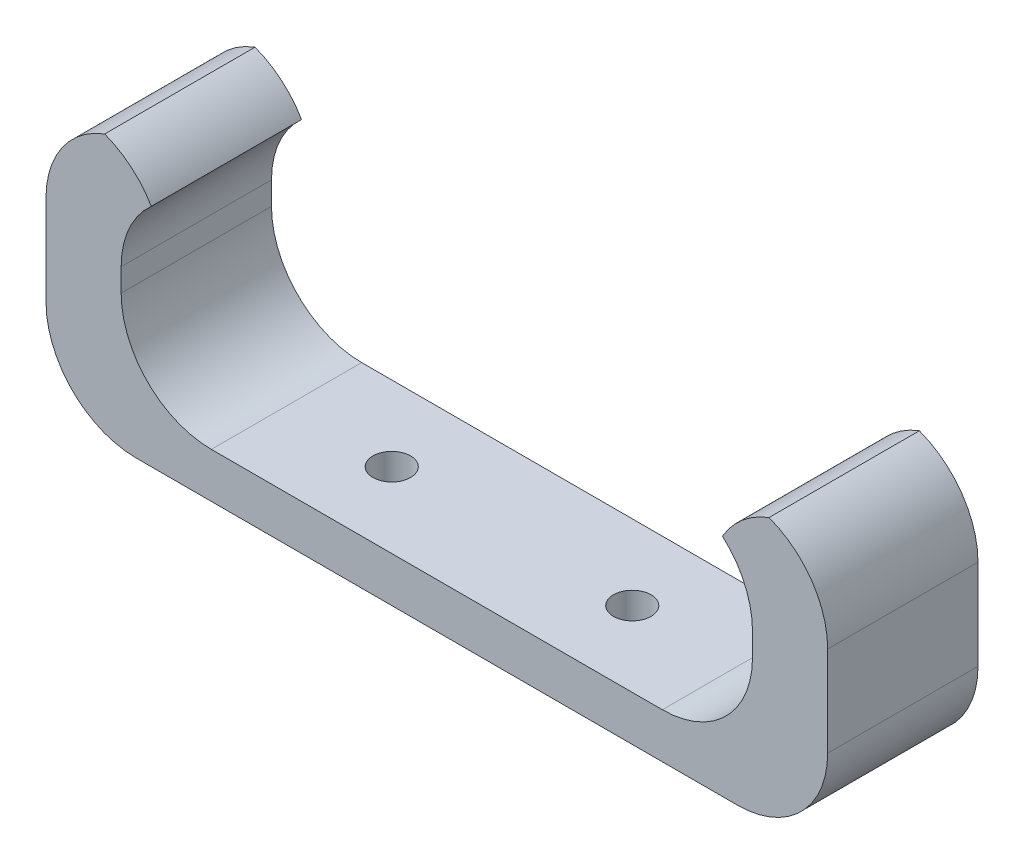
ISO-10303-21;
HEADER;
FILE_DESCRIPTION(('STEP AP214'),'2;1');
FILE_NAME('part.step','',(''),(''),'','','');
FILE_SCHEMA(('AUTOMOTIVE_DESIGN { 1 0 10303 214 1 1 1 1 }'));
ENDSEC;
DATA;
#1=APPLICATION_CONTEXT('core data for automotive mechanical design processes');
#2=APPLICATION_PROTOCOL_DEFINITION('international standard','automotive_design',2000,#1);
#3=PRODUCT_CONTEXT('',#1,'mechanical');
#4=PRODUCT('Part','Part','',(#3));
#5=PRODUCT_RELATED_PRODUCT_CATEGORY('part','',(#4));
#6=PRODUCT_DEFINITION_FORMATION('','',#4);
#7=PRODUCT_DEFINITION_CONTEXT('part definition',#1,'design');
#8=PRODUCT_DEFINITION('design','',#6,#7);
#9=PRODUCT_DEFINITION_SHAPE('','',#8);
#10=(LENGTH_UNIT() NAMED_UNIT(*) SI_UNIT(.MILLI.,.METRE.));
#11=(NAMED_UNIT(*) PLANE_ANGLE_UNIT() SI_UNIT($,.RADIAN.));
#12=(NAMED_UNIT(*) SI_UNIT($,.STERADIAN.) SOLID_ANGLE_UNIT());
#13=UNCERTAINTY_MEASURE_WITH_UNIT(LENGTH_MEASURE(1.E-05),#10,'distance_accuracy_value','');
#14=(GEOMETRIC_REPRESENTATION_CONTEXT(3) GLOBAL_UNCERTAINTY_ASSIGNED_CONTEXT((#13)) GLOBAL_UNIT_ASSIGNED_CONTEXT((#10,
#11,#12)) REPRESENTATION_CONTEXT('',''));
#15=CARTESIAN_POINT('',(0.,0.,0.));
#16=DIRECTION('',(0.,0.,1.));
#17=DIRECTION('',(1.,0.,0.));
#18=AXIS2_PLACEMENT_3D('',#15,#16,#17);
#19=CARTESIAN_POINT('',(29.,18.,5.));
#20=DIRECTION('',(-1.,0.,0.));
#21=DIRECTION('',(0.,0.,1.));
#22=AXIS2_PLACEMENT_3D('',#19,#20,#21);
#23=PLANE('',#22);
#24=DIRECTION('',(0.,-1.,0.));
#25=VECTOR('',#24,1.);
#26=CARTESIAN_POINT('',(29.,18.,5.));
#27=LINE('',#26,#25);
#28=CARTESIAN_POINT('',(29.,10.5278640450004,5.));
#29=VERTEX_POINT('',#28);
#30=CARTESIAN_POINT('',(29.,9.,5.));
#31=VERTEX_POINT('',#30);
#32=EDGE_CURVE('E309',#29,#31,#27,.T.);
#33=ORIENTED_EDGE('',*,*,#32,.F.);
#34=DIRECTION('',(0.,0.,-1.));
#35=VECTOR('',#34,1.);
#36=CARTESIAN_POINT('',(29.,10.5278640450004,-5.));
#37=LINE('',#36,#35);
#38=CARTESIAN_POINT('',(29.,10.5278640450004,-5.));
#39=VERTEX_POINT('',#38);
#40=EDGE_CURVE('E236',#29,#39,#37,.T.);
#41=ORIENTED_EDGE('',*,*,#40,.T.);
#42=DIRECTION('',(0.,-1.,0.));
#43=VECTOR('',#42,1.);
#44=CARTESIAN_POINT('',(29.,18.,-5.));
#45=LINE('',#44,#43);
#46=CARTESIAN_POINT('',(29.,9.,-5.));
#47=VERTEX_POINT('',#46);
#48=EDGE_CURVE('E167',#39,#47,#45,.T.);
#49=ORIENTED_EDGE('',*,*,#48,.T.);
#50=DIRECTION('',(0.,0.,-1.));
#51=VECTOR('',#50,1.);
#52=CARTESIAN_POINT('',(29.,9.,5.));
#53=LINE('',#52,#51);
#54=EDGE_CURVE('E233',#47,#31,#53,.F.);
#55=ORIENTED_EDGE('',*,*,#54,.T.);
#56=EDGE_LOOP('',(#33,#41,#49,#55));
#57=FACE_BOUND('',#56,.T.);
#58=ADVANCED_FACE('F45',(#57),#23,.T.);
#59=CARTESIAN_POINT('',(-13.,18.,5.));
#60=DIRECTION('',(1.,0.,0.));
#61=DIRECTION('',(0.,0.,-1.));
#62=AXIS2_PLACEMENT_3D('',#59,#60,#61);
#63=PLANE('',#62);
#64=DIRECTION('',(0.,-1.,0.));
#65=VECTOR('',#64,1.);
#66=CARTESIAN_POINT('',(-13.,18.,-5.));
#67=LINE('',#66,#65);
#68=CARTESIAN_POINT('',(-13.,10.5278640450004,-5.));
#69=VERTEX_POINT('',#68);
#70=CARTESIAN_POINT('',(-13.,9.,-5.));
#71=VERTEX_POINT('',#70);
#72=EDGE_CURVE('E287',#69,#71,#67,.T.);
#73=ORIENTED_EDGE('',*,*,#72,.F.);
#74=DIRECTION('',(0.,0.,1.));
#75=VECTOR('',#74,1.);
#76=CARTESIAN_POINT('',(-13.,10.5278640450004,5.));
#77=LINE('',#76,#75);
#78=CARTESIAN_POINT('',(-13.,10.5278640450004,5.));
#79=VERTEX_POINT('',#78);
#80=EDGE_CURVE('E250',#69,#79,#77,.T.);
#81=ORIENTED_EDGE('',*,*,#80,.T.);
#82=DIRECTION('',(0.,-1.,0.));
#83=VECTOR('',#82,1.);
#84=CARTESIAN_POINT('',(-13.,18.,5.));
#85=LINE('',#84,#83);
#86=CARTESIAN_POINT('',(-13.,9.,5.));
#87=VERTEX_POINT('',#86);
#88=EDGE_CURVE('E294',#79,#87,#85,.T.);
#89=ORIENTED_EDGE('',*,*,#88,.T.);
#90=DIRECTION('',(0.,0.,-1.));
#91=VECTOR('',#90,1.);
#92=CARTESIAN_POINT('',(-13.,9.,-5.));
#93=LINE('',#92,#91);
#94=EDGE_CURVE('E246',#87,#71,#93,.T.);
#95=ORIENTED_EDGE('',*,*,#94,.T.);
#96=EDGE_LOOP('',(#73,#81,#89,#95));
#97=FACE_BOUND('',#96,.T.);
#98=ADVANCED_FACE('F289',(#97),#63,.T.);
#99=CARTESIAN_POINT('',(0.,3.,5.));
#100=DIRECTION('',(0.,0.,-1.));
#101=DIRECTION('',(-1.,0.,0.));
#102=AXIS2_PLACEMENT_3D('',#99,#100,#101);
#103=PLANE('',#102);
#104=DIRECTION('',(0.,-1.,0.));
#105=VECTOR('',#104,1.);
#106=CARTESIAN_POINT('',(-18.,18.,5.));
#107=LINE('',#106,#105);
#108=CARTESIAN_POINT('',(-18.,12.,5.));
#109=VERTEX_POINT('',#108);
#110=CARTESIAN_POINT('',(-18.,6.,5.));
#111=VERTEX_POINT('',#110);
#112=EDGE_CURVE('E302',#109,#111,#107,.T.);
#113=ORIENTED_EDGE('',*,*,#112,.T.);
#114=CARTESIAN_POINT('',(-12.,6.,5.));
#115=DIRECTION('',(0.,0.,-1.));
#116=DIRECTION('',(-1.,0.,0.));
#117=AXIS2_PLACEMENT_3D('',#114,#115,#116);
#118=CIRCLE('',#117,6.);
#119=CARTESIAN_POINT('',(-12.,0.,5.));
#120=VERTEX_POINT('',#119);
#121=EDGE_CURVE('E223',#111,#120,#118,.F.);
#122=ORIENTED_EDGE('',*,*,#121,.T.);
#123=DIRECTION('',(1.,0.,0.));
#124=VECTOR('',#123,1.);
#125=CARTESIAN_POINT('',(0.,0.,5.));
#126=LINE('',#125,#124);
#127=CARTESIAN_POINT('',(28.,0.,5.));
#128=VERTEX_POINT('',#127);
#129=EDGE_CURVE('E335',#120,#128,#126,.T.);
#130=ORIENTED_EDGE('',*,*,#129,.T.);
#131=CARTESIAN_POINT('',(28.,6.,5.));
#132=DIRECTION('',(0.,0.,-1.));
#133=DIRECTION('',(-1.,0.,0.));
#134=AXIS2_PLACEMENT_3D('',#131,#132,#133);
#135=CIRCLE('',#134,6.);
#136=CARTESIAN_POINT('',(34.,6.,5.));
#137=VERTEX_POINT('',#136);
#138=EDGE_CURVE('E220',#128,#137,#135,.F.);
#139=ORIENTED_EDGE('',*,*,#138,.T.);
#140=DIRECTION('',(0.,-1.,0.));
#141=VECTOR('',#140,1.);
#142=CARTESIAN_POINT('',(34.,18.,5.));
#143=LINE('',#142,#141);
#144=CARTESIAN_POINT('',(34.,12.,5.));
#145=VERTEX_POINT('',#144);
#146=EDGE_CURVE('E180',#145,#137,#143,.T.);
#147=ORIENTED_EDGE('',*,*,#146,.F.);
#148=CARTESIAN_POINT('',(28.,12.,5.));
#149=DIRECTION('',(0.,0.,-1.));
#150=DIRECTION('',(-1.,0.,0.));
#151=AXIS2_PLACEMENT_3D('',#148,#149,#150);
#152=CIRCLE('',#151,6.);
#153=CARTESIAN_POINT('',(30.0980762113533,17.6212166130966,5.));
#154=VERTEX_POINT('',#153);
#155=EDGE_CURVE('E63',#145,#154,#152,.F.);
#156=ORIENTED_EDGE('',*,*,#155,.T.);
#157=CARTESIAN_POINT('',(32.1961524227066,12.,5.));
#158=DIRECTION('',(0.,0.,-1.));
#159=DIRECTION('',(-1.,0.,0.));
#160=AXIS2_PLACEMENT_3D('',#157,#158,#159);
#161=CIRCLE('',#160,6.);
#162=CARTESIAN_POINT('',(27.,15.,5.00000000000003));
#163=VERTEX_POINT('',#162);
#164=EDGE_CURVE('E215',#154,#163,#161,.F.);
#165=ORIENTED_EDGE('',*,*,#164,.T.);
#166=CARTESIAN_POINT('',(23.,10.5278640450004,5.));
#167=DIRECTION('',(0.,0.,-1.));
#168=DIRECTION('',(-1.,0.,0.));
#169=AXIS2_PLACEMENT_3D('',#166,#167,#168);
#170=CIRCLE('',#169,6.);
#171=EDGE_CURVE('E172',#163,#29,#170,.T.);
#172=ORIENTED_EDGE('',*,*,#171,.T.);
#173=ORIENTED_EDGE('',*,*,#32,.T.);
#174=CARTESIAN_POINT('',(23.,9.,5.));
#175=DIRECTION('',(0.,0.,-1.));
#176=DIRECTION('',(-1.,0.,0.));
#177=AXIS2_PLACEMENT_3D('',#174,#175,#176);
#178=CIRCLE('',#177,6.);
#179=CARTESIAN_POINT('',(23.,3.,5.));
#180=VERTEX_POINT('',#179);
#181=EDGE_CURVE('E257',#31,#180,#178,.T.);
#182=ORIENTED_EDGE('',*,*,#181,.T.);
#183=DIRECTION('',(1.,0.,0.));
#184=VECTOR('',#183,1.);
#185=CARTESIAN_POINT('',(0.,3.,5.));
#186=LINE('',#185,#184);
#187=CARTESIAN_POINT('',(-7.,3.,5.));
#188=VERTEX_POINT('',#187);
#189=EDGE_CURVE('E319',#188,#180,#186,.T.);
#190=ORIENTED_EDGE('',*,*,#189,.F.);
#191=CARTESIAN_POINT('',(-7.,9.,5.));
#192=DIRECTION('',(0.,0.,-1.));
#193=DIRECTION('',(-1.,0.,0.));
#194=AXIS2_PLACEMENT_3D('',#191,#192,#193);
#195=CIRCLE('',#194,6.);
#196=EDGE_CURVE('E11',#188,#87,#195,.T.);
#197=ORIENTED_EDGE('',*,*,#196,.T.);
#198=ORIENTED_EDGE('',*,*,#88,.F.);
#199=CARTESIAN_POINT('',(-7.,10.5278640450004,5.));
#200=DIRECTION('',(0.,0.,-1.));
#201=DIRECTION('',(-1.,0.,0.));
#202=AXIS2_PLACEMENT_3D('',#199,#200,#201);
#203=CIRCLE('',#202,6.);
#204=CARTESIAN_POINT('',(-11.,15.,5.));
#205=VERTEX_POINT('',#204);
#206=EDGE_CURVE('E263',#79,#205,#203,.T.);
#207=ORIENTED_EDGE('',*,*,#206,.T.);
#208=CARTESIAN_POINT('',(-16.1961524227066,12.,5.));
#209=DIRECTION('',(0.,0.,-1.));
#210=DIRECTION('',(-1.,0.,0.));
#211=AXIS2_PLACEMENT_3D('',#208,#209,#210);
#212=CIRCLE('',#211,6.);
#213=CARTESIAN_POINT('',(-14.0980762113533,17.6212166130966,5.));
#214=VERTEX_POINT('',#213);
#215=EDGE_CURVE('E70',#205,#214,#212,.F.);
#216=ORIENTED_EDGE('',*,*,#215,.T.);
#217=CARTESIAN_POINT('',(-12.,12.,5.));
#218=DIRECTION('',(0.,0.,-1.));
#219=DIRECTION('',(-1.,0.,0.));
#220=AXIS2_PLACEMENT_3D('',#217,#218,#219);
#221=CIRCLE('',#220,6.);
#222=EDGE_CURVE('E212',#214,#109,#221,.F.);
#223=ORIENTED_EDGE('',*,*,#222,.T.);
#224=EDGE_LOOP('',(#113,#122,#130,#139,#147,#156,#165,#172,#173,#182,#190,#197,#198,#207,#216,#223));
#225=FACE_BOUND('',#224,.T.);
#226=ADVANCED_FACE('F364',(#225),#103,.F.);
#227=CARTESIAN_POINT('',(0.,3.,-5.));
#228=DIRECTION('',(0.,0.,-1.));
#229=DIRECTION('',(-1.,0.,0.));
#230=AXIS2_PLACEMENT_3D('',#227,#228,#229);
#231=PLANE('',#230);
#232=DIRECTION('',(1.,0.,0.));
#233=VECTOR('',#232,1.);
#234=CARTESIAN_POINT('',(0.,0.,-5.));
#235=LINE('',#234,#233);
#236=CARTESIAN_POINT('',(-12.,0.,-5.));
#237=VERTEX_POINT('',#236);
#238=CARTESIAN_POINT('',(28.,0.,-5.));
#239=VERTEX_POINT('',#238);
#240=EDGE_CURVE('E315',#237,#239,#235,.T.);
#241=ORIENTED_EDGE('',*,*,#240,.F.);
#242=CARTESIAN_POINT('',(-12.,6.,-5.));
#243=DIRECTION('',(0.,0.,-1.));
#244=DIRECTION('',(-1.,0.,0.));
#245=AXIS2_PLACEMENT_3D('',#242,#243,#244);
#246=CIRCLE('',#245,6.);
#247=CARTESIAN_POINT('',(-18.,6.,-5.));
#248=VERTEX_POINT('',#247);
#249=EDGE_CURVE('E200',#237,#248,#246,.T.);
#250=ORIENTED_EDGE('',*,*,#249,.T.);
#251=DIRECTION('',(0.,-1.,0.));
#252=VECTOR('',#251,1.);
#253=CARTESIAN_POINT('',(-18.,18.,-5.));
#254=LINE('',#253,#252);
#255=CARTESIAN_POINT('',(-18.,12.,-5.));
#256=VERTEX_POINT('',#255);
#257=EDGE_CURVE('E295',#256,#248,#254,.T.);
#258=ORIENTED_EDGE('',*,*,#257,.F.);
#259=CARTESIAN_POINT('',(-12.,12.,-5.));
#260=DIRECTION('',(0.,0.,-1.));
#261=DIRECTION('',(-1.,0.,0.));
#262=AXIS2_PLACEMENT_3D('',#259,#260,#261);
#263=CIRCLE('',#262,6.);
#264=CARTESIAN_POINT('',(-14.0980762113533,17.6212166130966,-5.));
#265=VERTEX_POINT('',#264);
#266=EDGE_CURVE('E188',#256,#265,#263,.T.);
#267=ORIENTED_EDGE('',*,*,#266,.T.);
#268=CARTESIAN_POINT('',(-16.1961524227066,12.,-5.));
#269=DIRECTION('',(0.,0.,-1.));
#270=DIRECTION('',(-1.,0.,0.));
#271=AXIS2_PLACEMENT_3D('',#268,#269,#270);
#272=CIRCLE('',#271,6.);
#273=CARTESIAN_POINT('',(-11.,15.,-5.));
#274=VERTEX_POINT('',#273);
#275=EDGE_CURVE('E194',#265,#274,#272,.T.);
#276=ORIENTED_EDGE('',*,*,#275,.T.);
#277=CARTESIAN_POINT('',(-7.,10.5278640450004,-5.));
#278=DIRECTION('',(0.,0.,-1.));
#279=DIRECTION('',(-1.,0.,0.));
#280=AXIS2_PLACEMENT_3D('',#277,#278,#279);
#281=CIRCLE('',#280,6.);
#282=EDGE_CURVE('E260',#274,#69,#281,.F.);
#283=ORIENTED_EDGE('',*,*,#282,.T.);
#284=ORIENTED_EDGE('',*,*,#72,.T.);
#285=CARTESIAN_POINT('',(-7.,9.,-5.));
#286=DIRECTION('',(0.,0.,-1.));
#287=DIRECTION('',(-1.,0.,0.));
#288=AXIS2_PLACEMENT_3D('',#285,#286,#287);
#289=CIRCLE('',#288,6.);
#290=CARTESIAN_POINT('',(-7.,3.,-5.));
#291=VERTEX_POINT('',#290);
#292=EDGE_CURVE('E55',#71,#291,#289,.F.);
#293=ORIENTED_EDGE('',*,*,#292,.T.);
#294=DIRECTION('',(1.,0.,0.));
#295=VECTOR('',#294,1.);
#296=CARTESIAN_POINT('',(0.,3.,-5.));
#297=LINE('',#296,#295);
#298=CARTESIAN_POINT('',(23.,3.,-5.));
#299=VERTEX_POINT('',#298);
#300=EDGE_CURVE('E323',#291,#299,#297,.T.);
#301=ORIENTED_EDGE('',*,*,#300,.T.);
#302=CARTESIAN_POINT('',(23.,9.,-5.));
#303=DIRECTION('',(0.,0.,-1.));
#304=DIRECTION('',(-1.,0.,0.));
#305=AXIS2_PLACEMENT_3D('',#302,#303,#304);
#306=CIRCLE('',#305,6.);
#307=EDGE_CURVE('E171',#299,#47,#306,.F.);
#308=ORIENTED_EDGE('',*,*,#307,.T.);
#309=ORIENTED_EDGE('',*,*,#48,.F.);
#310=CARTESIAN_POINT('',(23.,10.5278640450004,-5.));
#311=DIRECTION('',(0.,0.,-1.));
#312=DIRECTION('',(-1.,0.,0.));
#313=AXIS2_PLACEMENT_3D('',#310,#311,#312);
#314=CIRCLE('',#313,6.);
#315=CARTESIAN_POINT('',(27.,15.,-4.99999999999997));
#316=VERTEX_POINT('',#315);
#317=EDGE_CURVE('E159',#39,#316,#314,.F.);
#318=ORIENTED_EDGE('',*,*,#317,.T.);
#319=CARTESIAN_POINT('',(32.1961524227066,12.,-5.));
#320=DIRECTION('',(0.,0.,-1.));
#321=DIRECTION('',(-1.,0.,0.));
#322=AXIS2_PLACEMENT_3D('',#319,#320,#321);
#323=CIRCLE('',#322,6.);
#324=CARTESIAN_POINT('',(30.0980762113533,17.6212166130966,-5.));
#325=VERTEX_POINT('',#324);
#326=EDGE_CURVE('E164',#316,#325,#323,.T.);
#327=ORIENTED_EDGE('',*,*,#326,.T.);
#328=CARTESIAN_POINT('',(28.,12.,-5.));
#329=DIRECTION('',(0.,0.,-1.));
#330=DIRECTION('',(-1.,0.,0.));
#331=AXIS2_PLACEMENT_3D('',#328,#329,#330);
#332=CIRCLE('',#331,6.);
#333=CARTESIAN_POINT('',(34.,12.,-5.));
#334=VERTEX_POINT('',#333);
#335=EDGE_CURVE('E187',#325,#334,#332,.T.);
#336=ORIENTED_EDGE('',*,*,#335,.T.);
#337=DIRECTION('',(0.,-1.,0.));
#338=VECTOR('',#337,1.);
#339=CARTESIAN_POINT('',(34.,18.,-5.));
#340=LINE('',#339,#338);
#341=CARTESIAN_POINT('',(34.,6.,-5.));
#342=VERTEX_POINT('',#341);
#343=EDGE_CURVE('E360',#334,#342,#340,.T.);
#344=ORIENTED_EDGE('',*,*,#343,.T.);
#345=CARTESIAN_POINT('',(28.,6.,-5.));
#346=DIRECTION('',(0.,0.,-1.));
#347=DIRECTION('',(-1.,0.,0.));
#348=AXIS2_PLACEMENT_3D('',#345,#346,#347);
#349=CIRCLE('',#348,6.);
#350=EDGE_CURVE('E192',#342,#239,#349,.T.);
#351=ORIENTED_EDGE('',*,*,#350,.T.);
#352=EDGE_LOOP('',(#241,#250,#258,#267,#276,#283,#284,#293,#301,#308,#309,#318,#327,#336,#344,#351));
#353=FACE_BOUND('',#352,.T.);
#354=ADVANCED_FACE('F162',(#353),#231,.T.);
#355=CARTESIAN_POINT('',(0.,3.,0.));
#356=DIRECTION('',(0.,-1.,0.));
#357=DIRECTION('',(0.,0.,-1.));
#358=AXIS2_PLACEMENT_3D('',#355,#356,#357);
#359=CYLINDRICAL_SURFACE('',#358,1.25);
#360=CARTESIAN_POINT('',(0.,3.,0.));
#361=DIRECTION('',(0.,1.,0.));
#362=DIRECTION('',(0.,0.,1.));
#363=AXIS2_PLACEMENT_3D('',#360,#361,#362);
#364=CIRCLE('',#363,1.25);
#365=CARTESIAN_POINT('',(0.,3.,1.25));
#366=VERTEX_POINT('',#365);
#367=EDGE_CURVE('E314',#366,#366,#364,.T.);
#368=ORIENTED_EDGE('',*,*,#367,.T.);
#369=EDGE_LOOP('',(#368));
#370=FACE_BOUND('',#369,.T.);
#371=CARTESIAN_POINT('',(0.,0.,0.));
#372=DIRECTION('',(0.,1.,0.));
#373=DIRECTION('',(0.,0.,1.));
#374=AXIS2_PLACEMENT_3D('',#371,#372,#373);
#375=CIRCLE('',#374,1.25);
#376=CARTESIAN_POINT('',(0.,0.,1.25));
#377=VERTEX_POINT('',#376);
#378=EDGE_CURVE('E331',#377,#377,#375,.T.);
#379=ORIENTED_EDGE('',*,*,#378,.F.);
#380=EDGE_LOOP('',(#379));
#381=FACE_BOUND('',#380,.T.);
#382=ADVANCED_FACE('F408',(#370,#381),#359,.F.);
#383=CARTESIAN_POINT('',(16.,3.,0.));
#384=DIRECTION('',(0.,-1.,0.));
#385=DIRECTION('',(0.,0.,-1.));
#386=AXIS2_PLACEMENT_3D('',#383,#384,#385);
#387=CYLINDRICAL_SURFACE('',#386,1.25);
#388=CARTESIAN_POINT('',(16.,3.,0.));
#389=DIRECTION('',(0.,1.,0.));
#390=DIRECTION('',(0.,0.,1.));
#391=AXIS2_PLACEMENT_3D('',#388,#389,#390);
#392=CIRCLE('',#391,1.25);
#393=CARTESIAN_POINT('',(16.,3.,1.25));
#394=VERTEX_POINT('',#393);
#395=EDGE_CURVE('E310',#394,#394,#392,.T.);
#396=ORIENTED_EDGE('',*,*,#395,.T.);
#397=EDGE_LOOP('',(#396));
#398=FACE_BOUND('',#397,.T.);
#399=CARTESIAN_POINT('',(16.,0.,0.));
#400=DIRECTION('',(0.,1.,0.));
#401=DIRECTION('',(0.,0.,1.));
#402=AXIS2_PLACEMENT_3D('',#399,#400,#401);
#403=CIRCLE('',#402,1.25);
#404=CARTESIAN_POINT('',(16.,0.,1.25));
#405=VERTEX_POINT('',#404);
#406=EDGE_CURVE('E299',#405,#405,#403,.T.);
#407=ORIENTED_EDGE('',*,*,#406,.F.);
#408=EDGE_LOOP('',(#407));
#409=FACE_BOUND('',#408,.T.);
#410=ADVANCED_FACE('F401',(#398,#409),#387,.F.);
#411=CARTESIAN_POINT('',(0.,3.,0.));
#412=DIRECTION('',(0.,1.,0.));
#413=DIRECTION('',(0.,0.,1.));
#414=AXIS2_PLACEMENT_3D('',#411,#412,#413);
#415=PLANE('',#414);
#416=ORIENTED_EDGE('',*,*,#395,.F.);
#417=EDGE_LOOP('',(#416));
#418=FACE_BOUND('',#417,.T.);
#419=ORIENTED_EDGE('',*,*,#367,.F.);
#420=EDGE_LOOP('',(#419));
#421=FACE_BOUND('',#420,.T.);
#422=ORIENTED_EDGE('',*,*,#189,.T.);
#423=DIRECTION('',(0.,0.,-1.));
#424=VECTOR('',#423,1.);
#425=CARTESIAN_POINT('',(23.,3.,-5.00000000000001));
#426=LINE('',#425,#424);
#427=EDGE_CURVE('E242',#180,#299,#426,.T.);
#428=ORIENTED_EDGE('',*,*,#427,.T.);
#429=ORIENTED_EDGE('',*,*,#300,.F.);
#430=DIRECTION('',(0.,0.,-1.));
#431=VECTOR('',#430,1.);
#432=CARTESIAN_POINT('',(-7.,3.,5.));
#433=LINE('',#432,#431);
#434=EDGE_CURVE('E239',#291,#188,#433,.F.);
#435=ORIENTED_EDGE('',*,*,#434,.T.);
#436=EDGE_LOOP('',(#422,#428,#429,#435));
#437=FACE_BOUND('',#436,.T.);
#438=ADVANCED_FACE('F398',(#418,#421,#437),#415,.T.);
#439=CARTESIAN_POINT('',(0.,0.,0.));
#440=DIRECTION('',(0.,1.,0.));
#441=DIRECTION('',(0.,0.,1.));
#442=AXIS2_PLACEMENT_3D('',#439,#440,#441);
#443=PLANE('',#442);
#444=ORIENTED_EDGE('',*,*,#406,.T.);
#445=EDGE_LOOP('',(#444));
#446=FACE_BOUND('',#445,.T.);
#447=ORIENTED_EDGE('',*,*,#378,.T.);
#448=EDGE_LOOP('',(#447));
#449=FACE_BOUND('',#448,.T.);
#450=ORIENTED_EDGE('',*,*,#129,.F.);
#451=DIRECTION('',(0.,0.,-1.));
#452=VECTOR('',#451,1.);
#453=CARTESIAN_POINT('',(-12.,0.,-5.));
#454=LINE('',#453,#452);
#455=EDGE_CURVE('E345',#120,#237,#454,.T.);
#456=ORIENTED_EDGE('',*,*,#455,.T.);
#457=ORIENTED_EDGE('',*,*,#240,.T.);
#458=DIRECTION('',(0.,0.,1.));
#459=VECTOR('',#458,1.);
#460=CARTESIAN_POINT('',(28.,0.,5.));
#461=LINE('',#460,#459);
#462=EDGE_CURVE('E327',#239,#128,#461,.T.);
#463=ORIENTED_EDGE('',*,*,#462,.T.);
#464=EDGE_LOOP('',(#450,#456,#457,#463));
#465=FACE_BOUND('',#464,.T.);
#466=ADVANCED_FACE('F352',(#446,#449,#465),#443,.F.);
#467=CARTESIAN_POINT('',(-18.,18.,5.));
#468=DIRECTION('',(-1.,0.,0.));
#469=DIRECTION('',(0.,0.,1.));
#470=AXIS2_PLACEMENT_3D('',#467,#468,#469);
#471=PLANE('',#470);
#472=ORIENTED_EDGE('',*,*,#257,.T.);
#473=DIRECTION('',(0.,0.,-1.));
#474=VECTOR('',#473,1.);
#475=CARTESIAN_POINT('',(-18.,6.,5.));
#476=LINE('',#475,#474);
#477=EDGE_CURVE('E207',#248,#111,#476,.F.);
#478=ORIENTED_EDGE('',*,*,#477,.T.);
#479=ORIENTED_EDGE('',*,*,#112,.F.);
#480=DIRECTION('',(0.,0.,-1.));
#481=VECTOR('',#480,1.);
#482=CARTESIAN_POINT('',(-18.,12.,-5.));
#483=LINE('',#482,#481);
#484=EDGE_CURVE('E203',#109,#256,#483,.T.);
#485=ORIENTED_EDGE('',*,*,#484,.T.);
#486=EDGE_LOOP('',(#472,#478,#479,#485));
#487=FACE_BOUND('',#486,.T.);
#488=ADVANCED_FACE('F370',(#487),#471,.T.);
#489=CARTESIAN_POINT('',(34.,18.,5.));
#490=DIRECTION('',(1.,0.,0.));
#491=DIRECTION('',(0.,0.,-1.));
#492=AXIS2_PLACEMENT_3D('',#489,#490,#491);
#493=PLANE('',#492);
#494=ORIENTED_EDGE('',*,*,#146,.T.);
#495=DIRECTION('',(0.,0.,1.));
#496=VECTOR('',#495,1.);
#497=CARTESIAN_POINT('',(34.,6.,-5.));
#498=LINE('',#497,#496);
#499=EDGE_CURVE('E230',#137,#342,#498,.F.);
#500=ORIENTED_EDGE('',*,*,#499,.T.);
#501=ORIENTED_EDGE('',*,*,#343,.F.);
#502=DIRECTION('',(0.,0.,1.));
#503=VECTOR('',#502,1.);
#504=CARTESIAN_POINT('',(34.,12.,5.));
#505=LINE('',#504,#503);
#506=EDGE_CURVE('E226',#334,#145,#505,.T.);
#507=ORIENTED_EDGE('',*,*,#506,.T.);
#508=EDGE_LOOP('',(#494,#500,#501,#507));
#509=FACE_BOUND('',#508,.T.);
#510=ADVANCED_FACE('F392',(#509),#493,.T.);
#511=CARTESIAN_POINT('',(-12.,6.,0.));
#512=DIRECTION('',(0.,0.,1.));
#513=DIRECTION('',(1.,0.,0.));
#514=AXIS2_PLACEMENT_3D('',#511,#512,#513);
#515=CYLINDRICAL_SURFACE('',#514,6.);
#516=ORIENTED_EDGE('',*,*,#121,.F.);
#517=ORIENTED_EDGE('',*,*,#477,.F.);
#518=ORIENTED_EDGE('',*,*,#249,.F.);
#519=ORIENTED_EDGE('',*,*,#455,.F.);
#520=EDGE_LOOP('',(#516,#517,#518,#519));
#521=FACE_BOUND('',#520,.T.);
#522=ADVANCED_FACE('F368',(#521),#515,.T.);
#523=CARTESIAN_POINT('',(28.,6.,0.));
#524=DIRECTION('',(0.,0.,-1.));
#525=DIRECTION('',(-1.,0.,0.));
#526=AXIS2_PLACEMENT_3D('',#523,#524,#525);
#527=CYLINDRICAL_SURFACE('',#526,6.);
#528=ORIENTED_EDGE('',*,*,#350,.F.);
#529=ORIENTED_EDGE('',*,*,#499,.F.);
#530=ORIENTED_EDGE('',*,*,#138,.F.);
#531=ORIENTED_EDGE('',*,*,#462,.F.);
#532=EDGE_LOOP('',(#528,#529,#530,#531));
#533=FACE_BOUND('',#532,.T.);
#534=ADVANCED_FACE('F363',(#533),#527,.T.);
#535=CARTESIAN_POINT('',(23.,10.5278640450004,-4.99999999999997));
#536=DIRECTION('',(0.,0.,1.));
#537=DIRECTION('',(1.,0.,0.));
#538=AXIS2_PLACEMENT_3D('',#535,#536,#537);
#539=CYLINDRICAL_SURFACE('',#538,6.);
#540=ORIENTED_EDGE('',*,*,#40,.F.);
#541=ORIENTED_EDGE('',*,*,#171,.F.);
#542=DIRECTION('',(0.,0.,1.));
#543=VECTOR('',#542,1.);
#544=CARTESIAN_POINT('',(27.,15.,-4.99999999999997));
#545=LINE('',#544,#543);
#546=EDGE_CURVE('E176',#316,#163,#545,.T.);
#547=ORIENTED_EDGE('',*,*,#546,.F.);
#548=ORIENTED_EDGE('',*,*,#317,.F.);
#549=EDGE_LOOP('',(#540,#541,#547,#548));
#550=FACE_BOUND('',#549,.T.);
#551=ADVANCED_FACE('F177',(#550),#539,.F.);
#552=CARTESIAN_POINT('',(32.1961524227066,12.,0.));
#553=DIRECTION('',(0.,0.,-1.));
#554=DIRECTION('',(-1.,0.,0.));
#555=AXIS2_PLACEMENT_3D('',#552,#553,#554);
#556=CYLINDRICAL_SURFACE('',#555,6.);
#557=DIRECTION('',(0.,0.,-1.));
#558=VECTOR('',#557,1.);
#559=CARTESIAN_POINT('',(30.0980762113533,17.6212166130966,0.));
#560=LINE('',#559,#558);
#561=EDGE_CURVE('E181',#325,#154,#560,.F.);
#562=ORIENTED_EDGE('',*,*,#561,.F.);
#563=ORIENTED_EDGE('',*,*,#326,.F.);
#564=ORIENTED_EDGE('',*,*,#546,.T.);
#565=ORIENTED_EDGE('',*,*,#164,.F.);
#566=EDGE_LOOP('',(#562,#563,#564,#565));
#567=FACE_BOUND('',#566,.T.);
#568=ADVANCED_FACE('F183',(#567),#556,.T.);
#569=CARTESIAN_POINT('',(28.,12.,5.));
#570=DIRECTION('',(0.,0.,1.));
#571=DIRECTION('',(1.,0.,0.));
#572=AXIS2_PLACEMENT_3D('',#569,#570,#571);
#573=CYLINDRICAL_SURFACE('',#572,6.);
#574=ORIENTED_EDGE('',*,*,#335,.F.);
#575=ORIENTED_EDGE('',*,*,#561,.T.);
#576=ORIENTED_EDGE('',*,*,#155,.F.);
#577=ORIENTED_EDGE('',*,*,#506,.F.);
#578=EDGE_LOOP('',(#574,#575,#576,#577));
#579=FACE_BOUND('',#578,.T.);
#580=ADVANCED_FACE('F421',(#579),#573,.T.);
#581=CARTESIAN_POINT('',(-7.,10.5278640450004,5.));
#582=DIRECTION('',(0.,0.,-1.));
#583=DIRECTION('',(-1.,0.,0.));
#584=AXIS2_PLACEMENT_3D('',#581,#582,#583);
#585=CYLINDRICAL_SURFACE('',#584,6.);
#586=ORIENTED_EDGE('',*,*,#80,.F.);
#587=ORIENTED_EDGE('',*,*,#282,.F.);
#588=DIRECTION('',(0.,0.,-1.));
#589=VECTOR('',#588,1.);
#590=CARTESIAN_POINT('',(-11.,15.,5.));
#591=LINE('',#590,#589);
#592=EDGE_CURVE('E49',#205,#274,#591,.T.);
#593=ORIENTED_EDGE('',*,*,#592,.F.);
#594=ORIENTED_EDGE('',*,*,#206,.F.);
#595=EDGE_LOOP('',(#586,#587,#593,#594));
#596=FACE_BOUND('',#595,.T.);
#597=ADVANCED_FACE('F284',(#596),#585,.F.);
#598=CARTESIAN_POINT('',(-16.1961524227066,12.,0.));
#599=DIRECTION('',(0.,0.,1.));
#600=DIRECTION('',(1.,0.,0.));
#601=AXIS2_PLACEMENT_3D('',#598,#599,#600);
#602=CYLINDRICAL_SURFACE('',#601,6.);
#603=DIRECTION('',(0.,0.,1.));
#604=VECTOR('',#603,1.);
#605=CARTESIAN_POINT('',(-14.0980762113533,17.6212166130966,0.));
#606=LINE('',#605,#604);
#607=EDGE_CURVE('E269',#214,#265,#606,.F.);
#608=ORIENTED_EDGE('',*,*,#607,.F.);
#609=ORIENTED_EDGE('',*,*,#215,.F.);
#610=ORIENTED_EDGE('',*,*,#592,.T.);
#611=ORIENTED_EDGE('',*,*,#275,.F.);
#612=EDGE_LOOP('',(#608,#609,#610,#611));
#613=FACE_BOUND('',#612,.T.);
#614=ADVANCED_FACE('F279',(#613),#602,.T.);
#615=CARTESIAN_POINT('',(-12.,12.,5.));
#616=DIRECTION('',(0.,0.,1.));
#617=DIRECTION('',(1.,0.,0.));
#618=AXIS2_PLACEMENT_3D('',#615,#616,#617);
#619=CYLINDRICAL_SURFACE('',#618,6.);
#620=ORIENTED_EDGE('',*,*,#222,.F.);
#621=ORIENTED_EDGE('',*,*,#607,.T.);
#622=ORIENTED_EDGE('',*,*,#266,.F.);
#623=ORIENTED_EDGE('',*,*,#484,.F.);
#624=EDGE_LOOP('',(#620,#621,#622,#623));
#625=FACE_BOUND('',#624,.T.);
#626=ADVANCED_FACE('F372',(#625),#619,.T.);
#627=CARTESIAN_POINT('',(23.,9.,0.));
#628=DIRECTION('',(0.,0.,1.));
#629=DIRECTION('',(1.,0.,0.));
#630=AXIS2_PLACEMENT_3D('',#627,#628,#629);
#631=CYLINDRICAL_SURFACE('',#630,6.);
#632=ORIENTED_EDGE('',*,*,#181,.F.);
#633=ORIENTED_EDGE('',*,*,#54,.F.);
#634=ORIENTED_EDGE('',*,*,#307,.F.);
#635=ORIENTED_EDGE('',*,*,#427,.F.);
#636=EDGE_LOOP('',(#632,#633,#634,#635));
#637=FACE_BOUND('',#636,.T.);
#638=ADVANCED_FACE('F374',(#637),#631,.F.);
#639=CARTESIAN_POINT('',(-7.,9.,5.));
#640=DIRECTION('',(0.,0.,1.));
#641=DIRECTION('',(1.,0.,0.));
#642=AXIS2_PLACEMENT_3D('',#639,#640,#641);
#643=CYLINDRICAL_SURFACE('',#642,6.);
#644=ORIENTED_EDGE('',*,*,#196,.F.);
#645=ORIENTED_EDGE('',*,*,#434,.F.);
#646=ORIENTED_EDGE('',*,*,#292,.F.);
#647=ORIENTED_EDGE('',*,*,#94,.F.);
#648=EDGE_LOOP('',(#644,#645,#646,#647));
#649=FACE_BOUND('',#648,.T.);
#650=ADVANCED_FACE('F47',(#649),#643,.F.);
#651=CLOSED_SHELL('',(#58,#98,#226,#354,#382,#410,#438,#466,#488,#510,#522,#534,#551,#568,#580,
#597,#614,#626,#638,#650));
#652=MANIFOLD_SOLID_BREP('B2',#651);
#653=ADVANCED_BREP_SHAPE_REPRESENTATION('',(#18,#652),#14);
#654=SHAPE_DEFINITION_REPRESENTATION(#9,#653);
ENDSEC;
END-ISO-10303-21;
